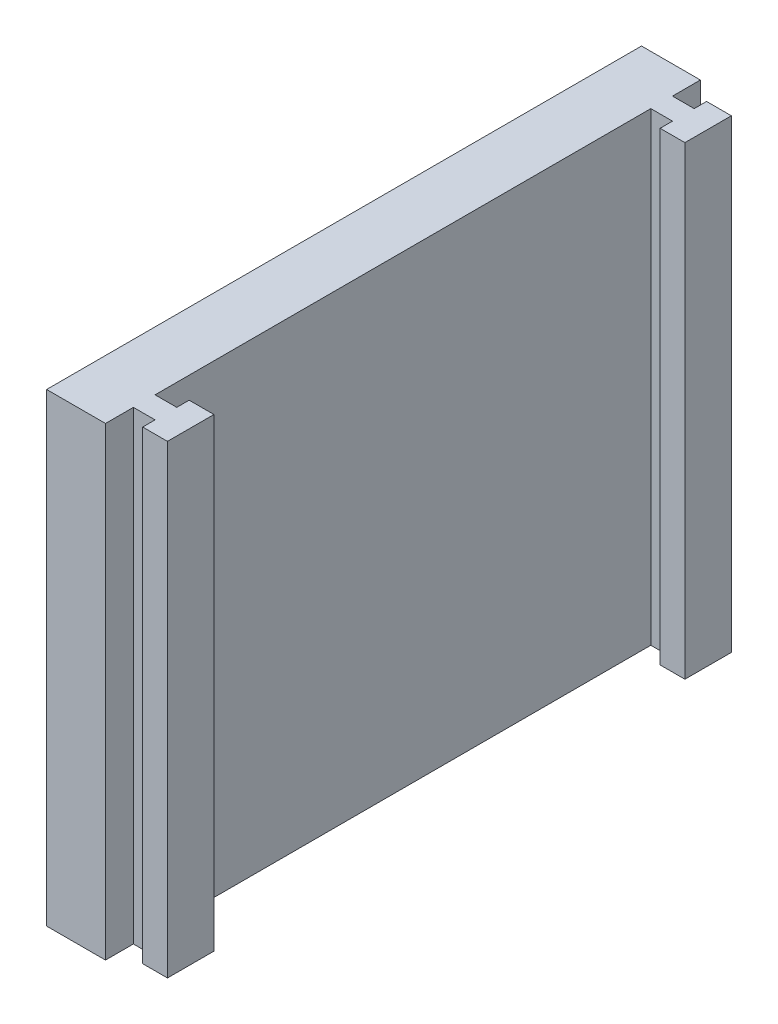
ISO-10303-21;
HEADER;
FILE_DESCRIPTION(('STEP AP214'),'2;1');
FILE_NAME('part.step','',(''),(''),'','','');
FILE_SCHEMA(('AUTOMOTIVE_DESIGN { 1 0 10303 214 1 1 1 1 }'));
ENDSEC;
DATA;
#1=APPLICATION_CONTEXT('core data for automotive mechanical design processes');
#2=APPLICATION_PROTOCOL_DEFINITION('international standard','automotive_design',2000,#1);
#3=PRODUCT_CONTEXT('',#1,'mechanical');
#4=PRODUCT('Part','Part','',(#3));
#5=PRODUCT_RELATED_PRODUCT_CATEGORY('part','',(#4));
#6=PRODUCT_DEFINITION_FORMATION('','',#4);
#7=PRODUCT_DEFINITION_CONTEXT('part definition',#1,'design');
#8=PRODUCT_DEFINITION('design','',#6,#7);
#9=PRODUCT_DEFINITION_SHAPE('','',#8);
#10=(LENGTH_UNIT() NAMED_UNIT(*) SI_UNIT(.MILLI.,.METRE.));
#11=(NAMED_UNIT(*) PLANE_ANGLE_UNIT() SI_UNIT($,.RADIAN.));
#12=(NAMED_UNIT(*) SI_UNIT($,.STERADIAN.) SOLID_ANGLE_UNIT());
#13=UNCERTAINTY_MEASURE_WITH_UNIT(LENGTH_MEASURE(1.E-05),#10,'distance_accuracy_value','');
#14=(GEOMETRIC_REPRESENTATION_CONTEXT(3) GLOBAL_UNCERTAINTY_ASSIGNED_CONTEXT((#13)) GLOBAL_UNIT_ASSIGNED_CONTEXT((#10,
#11,#12)) REPRESENTATION_CONTEXT('',''));
#15=CARTESIAN_POINT('',(0.,0.,0.));
#16=DIRECTION('',(0.,0.,1.));
#17=DIRECTION('',(1.,0.,0.));
#18=AXIS2_PLACEMENT_3D('',#15,#16,#17);
#19=CARTESIAN_POINT('',(19.,150.,-96.));
#20=DIRECTION('',(0.,0.,1.));
#21=DIRECTION('',(1.,0.,0.));
#22=AXIS2_PLACEMENT_3D('',#19,#20,#21);
#23=PLANE('',#22);
#24=DIRECTION('',(-1.,0.,0.));
#25=VECTOR('',#24,1.);
#26=CARTESIAN_POINT('',(19.,0.,-96.));
#27=LINE('',#26,#25);
#28=CARTESIAN_POINT('',(19.,0.,-96.));
#29=VERTEX_POINT('',#28);
#30=CARTESIAN_POINT('',(0.,0.,-96.));
#31=VERTEX_POINT('',#30);
#32=EDGE_CURVE('E158',#29,#31,#27,.T.);
#33=ORIENTED_EDGE('',*,*,#32,.T.);
#34=DIRECTION('',(0.,-1.,0.));
#35=VECTOR('',#34,1.);
#36=CARTESIAN_POINT('',(0.,150.,-96.));
#37=LINE('',#36,#35);
#38=CARTESIAN_POINT('',(0.,150.,-96.));
#39=VERTEX_POINT('',#38);
#40=EDGE_CURVE('E11',#39,#31,#37,.T.);
#41=ORIENTED_EDGE('',*,*,#40,.F.);
#42=DIRECTION('',(-1.,0.,0.));
#43=VECTOR('',#42,1.);
#44=CARTESIAN_POINT('',(19.,150.,-96.));
#45=LINE('',#44,#43);
#46=CARTESIAN_POINT('',(19.,150.,-96.));
#47=VERTEX_POINT('',#46);
#48=EDGE_CURVE('E181',#47,#39,#45,.T.);
#49=ORIENTED_EDGE('',*,*,#48,.F.);
#50=DIRECTION('',(0.,-1.,0.));
#51=VECTOR('',#50,1.);
#52=CARTESIAN_POINT('',(19.,150.,-96.));
#53=LINE('',#52,#51);
#54=EDGE_CURVE('E154',#47,#29,#53,.T.);
#55=ORIENTED_EDGE('',*,*,#54,.T.);
#56=EDGE_LOOP('',(#33,#41,#49,#55));
#57=FACE_BOUND('',#56,.T.);
#58=ADVANCED_FACE('F37',(#57),#23,.F.);
#59=CARTESIAN_POINT('',(0.,150.,0.));
#60=DIRECTION('',(1.,0.,0.));
#61=DIRECTION('',(0.,0.,-1.));
#62=AXIS2_PLACEMENT_3D('',#59,#60,#61);
#63=PLANE('',#62);
#64=DIRECTION('',(0.,0.,1.));
#65=VECTOR('',#64,1.);
#66=CARTESIAN_POINT('',(0.,0.,0.));
#67=LINE('',#66,#65);
#68=CARTESIAN_POINT('',(0.,0.,96.));
#69=VERTEX_POINT('',#68);
#70=EDGE_CURVE('E161',#31,#69,#67,.T.);
#71=ORIENTED_EDGE('',*,*,#70,.T.);
#72=DIRECTION('',(0.,-1.,0.));
#73=VECTOR('',#72,1.);
#74=CARTESIAN_POINT('',(0.,150.,96.));
#75=LINE('',#74,#73);
#76=CARTESIAN_POINT('',(0.,150.,96.));
#77=VERTEX_POINT('',#76);
#78=EDGE_CURVE('E259',#77,#69,#75,.T.);
#79=ORIENTED_EDGE('',*,*,#78,.F.);
#80=DIRECTION('',(0.,0.,1.));
#81=VECTOR('',#80,1.);
#82=CARTESIAN_POINT('',(0.,150.,0.));
#83=LINE('',#82,#81);
#84=EDGE_CURVE('E107',#39,#77,#83,.T.);
#85=ORIENTED_EDGE('',*,*,#84,.F.);
#86=ORIENTED_EDGE('',*,*,#40,.T.);
#87=EDGE_LOOP('',(#71,#79,#85,#86));
#88=FACE_BOUND('',#87,.T.);
#89=ADVANCED_FACE('F509',(#88),#63,.F.);
#90=CARTESIAN_POINT('',(19.,150.,-80.));
#91=DIRECTION('',(-1.,0.,0.));
#92=DIRECTION('',(0.,0.,1.));
#93=AXIS2_PLACEMENT_3D('',#90,#91,#92);
#94=PLANE('',#93);
#95=DIRECTION('',(0.,0.,-1.));
#96=VECTOR('',#95,1.);
#97=CARTESIAN_POINT('',(19.,0.,-80.));
#98=LINE('',#97,#96);
#99=CARTESIAN_POINT('',(19.,0.,80.));
#100=VERTEX_POINT('',#99);
#101=CARTESIAN_POINT('',(19.,0.,-80.));
#102=VERTEX_POINT('',#101);
#103=EDGE_CURVE('E165',#100,#102,#98,.T.);
#104=ORIENTED_EDGE('',*,*,#103,.T.);
#105=DIRECTION('',(0.,-1.,0.));
#106=VECTOR('',#105,1.);
#107=CARTESIAN_POINT('',(19.,150.,-80.));
#108=LINE('',#107,#106);
#109=CARTESIAN_POINT('',(19.,150.,-80.));
#110=VERTEX_POINT('',#109);
#111=EDGE_CURVE('E44',#110,#102,#108,.T.);
#112=ORIENTED_EDGE('',*,*,#111,.F.);
#113=DIRECTION('',(0.,0.,-1.));
#114=VECTOR('',#113,1.);
#115=CARTESIAN_POINT('',(19.,150.,-80.));
#116=LINE('',#115,#114);
#117=CARTESIAN_POINT('',(19.,150.,80.));
#118=VERTEX_POINT('',#117);
#119=EDGE_CURVE('E234',#118,#110,#116,.T.);
#120=ORIENTED_EDGE('',*,*,#119,.F.);
#121=DIRECTION('',(0.,-1.,0.));
#122=VECTOR('',#121,1.);
#123=CARTESIAN_POINT('',(19.,150.,80.));
#124=LINE('',#123,#122);
#125=EDGE_CURVE('E272',#118,#100,#124,.T.);
#126=ORIENTED_EDGE('',*,*,#125,.T.);
#127=EDGE_LOOP('',(#104,#112,#120,#126));
#128=FACE_BOUND('',#127,.T.);
#129=ADVANCED_FACE('F514',(#128),#94,.F.);
#130=CARTESIAN_POINT('',(26.,150.,-80.));
#131=DIRECTION('',(0.,0.,-1.));
#132=DIRECTION('',(-1.,0.,0.));
#133=AXIS2_PLACEMENT_3D('',#130,#131,#132);
#134=PLANE('',#133);
#135=DIRECTION('',(1.,0.,0.));
#136=VECTOR('',#135,1.);
#137=CARTESIAN_POINT('',(26.,0.,-80.));
#138=LINE('',#137,#136);
#139=CARTESIAN_POINT('',(26.,0.,-80.));
#140=VERTEX_POINT('',#139);
#141=EDGE_CURVE('E167',#102,#140,#138,.T.);
#142=ORIENTED_EDGE('',*,*,#141,.T.);
#143=DIRECTION('',(0.,-1.,0.));
#144=VECTOR('',#143,1.);
#145=CARTESIAN_POINT('',(26.,150.,-80.));
#146=LINE('',#145,#144);
#147=CARTESIAN_POINT('',(26.,150.,-80.));
#148=VERTEX_POINT('',#147);
#149=EDGE_CURVE('E194',#148,#140,#146,.T.);
#150=ORIENTED_EDGE('',*,*,#149,.F.);
#151=DIRECTION('',(1.,0.,0.));
#152=VECTOR('',#151,1.);
#153=CARTESIAN_POINT('',(26.,150.,-80.));
#154=LINE('',#153,#152);
#155=EDGE_CURVE('E203',#110,#148,#154,.T.);
#156=ORIENTED_EDGE('',*,*,#155,.F.);
#157=ORIENTED_EDGE('',*,*,#111,.T.);
#158=EDGE_LOOP('',(#142,#150,#156,#157));
#159=FACE_BOUND('',#158,.T.);
#160=ADVANCED_FACE('F201',(#159),#134,.F.);
#161=CARTESIAN_POINT('',(26.,150.,-76.));
#162=DIRECTION('',(1.,0.,0.));
#163=DIRECTION('',(0.,0.,-1.));
#164=AXIS2_PLACEMENT_3D('',#161,#162,#163);
#165=PLANE('',#164);
#166=DIRECTION('',(0.,0.,1.));
#167=VECTOR('',#166,1.);
#168=CARTESIAN_POINT('',(26.,0.,-76.));
#169=LINE('',#168,#167);
#170=CARTESIAN_POINT('',(26.,0.,-76.));
#171=VERTEX_POINT('',#170);
#172=EDGE_CURVE('E169',#140,#171,#169,.T.);
#173=ORIENTED_EDGE('',*,*,#172,.T.);
#174=DIRECTION('',(0.,-1.,0.));
#175=VECTOR('',#174,1.);
#176=CARTESIAN_POINT('',(26.,150.,-76.));
#177=LINE('',#176,#175);
#178=CARTESIAN_POINT('',(26.,150.,-76.));
#179=VERTEX_POINT('',#178);
#180=EDGE_CURVE('E191',#179,#171,#177,.T.);
#181=ORIENTED_EDGE('',*,*,#180,.F.);
#182=DIRECTION('',(0.,0.,1.));
#183=VECTOR('',#182,1.);
#184=CARTESIAN_POINT('',(26.,150.,-76.));
#185=LINE('',#184,#183);
#186=EDGE_CURVE('E228',#148,#179,#185,.T.);
#187=ORIENTED_EDGE('',*,*,#186,.F.);
#188=ORIENTED_EDGE('',*,*,#149,.T.);
#189=EDGE_LOOP('',(#173,#181,#187,#188));
#190=FACE_BOUND('',#189,.T.);
#191=ADVANCED_FACE('F219',(#190),#165,.F.);
#192=CARTESIAN_POINT('',(34.,150.,-76.));
#193=DIRECTION('',(0.,0.,-1.));
#194=DIRECTION('',(-1.,0.,0.));
#195=AXIS2_PLACEMENT_3D('',#192,#193,#194);
#196=PLANE('',#195);
#197=DIRECTION('',(1.,0.,0.));
#198=VECTOR('',#197,1.);
#199=CARTESIAN_POINT('',(34.,0.,-76.));
#200=LINE('',#199,#198);
#201=CARTESIAN_POINT('',(34.,0.,-76.));
#202=VERTEX_POINT('',#201);
#203=EDGE_CURVE('E171',#171,#202,#200,.T.);
#204=ORIENTED_EDGE('',*,*,#203,.T.);
#205=DIRECTION('',(0.,-1.,0.));
#206=VECTOR('',#205,1.);
#207=CARTESIAN_POINT('',(34.,150.,-76.));
#208=LINE('',#207,#206);
#209=CARTESIAN_POINT('',(34.,150.,-76.));
#210=VERTEX_POINT('',#209);
#211=EDGE_CURVE('E188',#210,#202,#208,.T.);
#212=ORIENTED_EDGE('',*,*,#211,.F.);
#213=DIRECTION('',(1.,0.,0.));
#214=VECTOR('',#213,1.);
#215=CARTESIAN_POINT('',(34.,150.,-76.));
#216=LINE('',#215,#214);
#217=EDGE_CURVE('E225',#179,#210,#216,.T.);
#218=ORIENTED_EDGE('',*,*,#217,.F.);
#219=ORIENTED_EDGE('',*,*,#180,.T.);
#220=EDGE_LOOP('',(#204,#212,#218,#219));
#221=FACE_BOUND('',#220,.T.);
#222=ADVANCED_FACE('F223',(#221),#196,.F.);
#223=CARTESIAN_POINT('',(34.,150.,-91.));
#224=DIRECTION('',(-1.,0.,0.));
#225=DIRECTION('',(0.,0.,1.));
#226=AXIS2_PLACEMENT_3D('',#223,#224,#225);
#227=PLANE('',#226);
#228=DIRECTION('',(0.,0.,-1.));
#229=VECTOR('',#228,1.);
#230=CARTESIAN_POINT('',(34.,0.,-91.));
#231=LINE('',#230,#229);
#232=CARTESIAN_POINT('',(34.,0.,-91.));
#233=VERTEX_POINT('',#232);
#234=EDGE_CURVE('E173',#202,#233,#231,.T.);
#235=ORIENTED_EDGE('',*,*,#234,.T.);
#236=DIRECTION('',(0.,-1.,0.));
#237=VECTOR('',#236,1.);
#238=CARTESIAN_POINT('',(34.,150.,-91.));
#239=LINE('',#238,#237);
#240=CARTESIAN_POINT('',(34.,150.,-91.));
#241=VERTEX_POINT('',#240);
#242=EDGE_CURVE('E185',#241,#233,#239,.T.);
#243=ORIENTED_EDGE('',*,*,#242,.F.);
#244=DIRECTION('',(0.,0.,-1.));
#245=VECTOR('',#244,1.);
#246=CARTESIAN_POINT('',(34.,150.,-91.));
#247=LINE('',#246,#245);
#248=EDGE_CURVE('E227',#210,#241,#247,.T.);
#249=ORIENTED_EDGE('',*,*,#248,.F.);
#250=ORIENTED_EDGE('',*,*,#211,.T.);
#251=EDGE_LOOP('',(#235,#243,#249,#250));
#252=FACE_BOUND('',#251,.T.);
#253=ADVANCED_FACE('F558',(#252),#227,.F.);
#254=CARTESIAN_POINT('',(26.,150.,-91.));
#255=DIRECTION('',(0.,0.,1.));
#256=DIRECTION('',(1.,0.,0.));
#257=AXIS2_PLACEMENT_3D('',#254,#255,#256);
#258=PLANE('',#257);
#259=DIRECTION('',(-1.,0.,0.));
#260=VECTOR('',#259,1.);
#261=CARTESIAN_POINT('',(26.,0.,-91.));
#262=LINE('',#261,#260);
#263=CARTESIAN_POINT('',(26.,0.,-91.));
#264=VERTEX_POINT('',#263);
#265=EDGE_CURVE('E175',#233,#264,#262,.T.);
#266=ORIENTED_EDGE('',*,*,#265,.T.);
#267=DIRECTION('',(0.,-1.,0.));
#268=VECTOR('',#267,1.);
#269=CARTESIAN_POINT('',(26.,150.,-91.));
#270=LINE('',#269,#268);
#271=CARTESIAN_POINT('',(26.,150.,-91.));
#272=VERTEX_POINT('',#271);
#273=EDGE_CURVE('E149',#272,#264,#270,.T.);
#274=ORIENTED_EDGE('',*,*,#273,.F.);
#275=DIRECTION('',(-1.,0.,0.));
#276=VECTOR('',#275,1.);
#277=CARTESIAN_POINT('',(26.,150.,-91.));
#278=LINE('',#277,#276);
#279=EDGE_CURVE('E137',#241,#272,#278,.T.);
#280=ORIENTED_EDGE('',*,*,#279,.F.);
#281=ORIENTED_EDGE('',*,*,#242,.T.);
#282=EDGE_LOOP('',(#266,#274,#280,#281));
#283=FACE_BOUND('',#282,.T.);
#284=ADVANCED_FACE('F561',(#283),#258,.F.);
#285=CARTESIAN_POINT('',(26.,150.,-87.));
#286=DIRECTION('',(1.,0.,0.));
#287=DIRECTION('',(0.,0.,-1.));
#288=AXIS2_PLACEMENT_3D('',#285,#286,#287);
#289=PLANE('',#288);
#290=DIRECTION('',(0.,0.,1.));
#291=VECTOR('',#290,1.);
#292=CARTESIAN_POINT('',(26.,0.,-87.));
#293=LINE('',#292,#291);
#294=CARTESIAN_POINT('',(26.,0.,-87.));
#295=VERTEX_POINT('',#294);
#296=EDGE_CURVE('E146',#264,#295,#293,.T.);
#297=ORIENTED_EDGE('',*,*,#296,.T.);
#298=DIRECTION('',(0.,-1.,0.));
#299=VECTOR('',#298,1.);
#300=CARTESIAN_POINT('',(26.,150.,-87.));
#301=LINE('',#300,#299);
#302=CARTESIAN_POINT('',(26.,150.,-87.));
#303=VERTEX_POINT('',#302);
#304=EDGE_CURVE('E143',#303,#295,#301,.T.);
#305=ORIENTED_EDGE('',*,*,#304,.F.);
#306=DIRECTION('',(0.,0.,1.));
#307=VECTOR('',#306,1.);
#308=CARTESIAN_POINT('',(26.,150.,-87.));
#309=LINE('',#308,#307);
#310=EDGE_CURVE('E130',#272,#303,#309,.T.);
#311=ORIENTED_EDGE('',*,*,#310,.F.);
#312=ORIENTED_EDGE('',*,*,#273,.T.);
#313=EDGE_LOOP('',(#297,#305,#311,#312));
#314=FACE_BOUND('',#313,.T.);
#315=ADVANCED_FACE('F144',(#314),#289,.F.);
#316=CARTESIAN_POINT('',(19.,150.,-87.));
#317=DIRECTION('',(0.,0.,1.));
#318=DIRECTION('',(1.,0.,0.));
#319=AXIS2_PLACEMENT_3D('',#316,#317,#318);
#320=PLANE('',#319);
#321=DIRECTION('',(-1.,0.,0.));
#322=VECTOR('',#321,1.);
#323=CARTESIAN_POINT('',(19.,0.,-87.));
#324=LINE('',#323,#322);
#325=CARTESIAN_POINT('',(19.,0.,-87.));
#326=VERTEX_POINT('',#325);
#327=EDGE_CURVE('E178',#295,#326,#324,.T.);
#328=ORIENTED_EDGE('',*,*,#327,.T.);
#329=DIRECTION('',(0.,-1.,0.));
#330=VECTOR('',#329,1.);
#331=CARTESIAN_POINT('',(19.,150.,-87.));
#332=LINE('',#331,#330);
#333=CARTESIAN_POINT('',(19.,150.,-87.));
#334=VERTEX_POINT('',#333);
#335=EDGE_CURVE('E150',#334,#326,#332,.T.);
#336=ORIENTED_EDGE('',*,*,#335,.F.);
#337=DIRECTION('',(-1.,0.,0.));
#338=VECTOR('',#337,1.);
#339=CARTESIAN_POINT('',(19.,150.,-87.));
#340=LINE('',#339,#338);
#341=EDGE_CURVE('E134',#303,#334,#340,.T.);
#342=ORIENTED_EDGE('',*,*,#341,.F.);
#343=ORIENTED_EDGE('',*,*,#304,.T.);
#344=EDGE_LOOP('',(#328,#336,#342,#343));
#345=FACE_BOUND('',#344,.T.);
#346=ADVANCED_FACE('F152',(#345),#320,.F.);
#347=CARTESIAN_POINT('',(19.,150.,-96.));
#348=DIRECTION('',(-1.,0.,0.));
#349=DIRECTION('',(0.,0.,1.));
#350=AXIS2_PLACEMENT_3D('',#347,#348,#349);
#351=PLANE('',#350);
#352=DIRECTION('',(0.,0.,-1.));
#353=VECTOR('',#352,1.);
#354=CARTESIAN_POINT('',(19.,0.,-96.));
#355=LINE('',#354,#353);
#356=EDGE_CURVE('E99',#326,#29,#355,.T.);
#357=ORIENTED_EDGE('',*,*,#356,.T.);
#358=ORIENTED_EDGE('',*,*,#54,.F.);
#359=DIRECTION('',(0.,0.,-1.));
#360=VECTOR('',#359,1.);
#361=CARTESIAN_POINT('',(19.,150.,-96.));
#362=LINE('',#361,#360);
#363=EDGE_CURVE('E60',#334,#47,#362,.T.);
#364=ORIENTED_EDGE('',*,*,#363,.F.);
#365=ORIENTED_EDGE('',*,*,#335,.T.);
#366=EDGE_LOOP('',(#357,#358,#364,#365));
#367=FACE_BOUND('',#366,.T.);
#368=ADVANCED_FACE('F570',(#367),#351,.F.);
#369=CARTESIAN_POINT('',(0.,150.,0.));
#370=DIRECTION('',(0.,-1.,0.));
#371=DIRECTION('',(0.,0.,-1.));
#372=AXIS2_PLACEMENT_3D('',#369,#370,#371);
#373=PLANE('',#372);
#374=ORIENTED_EDGE('',*,*,#48,.T.);
#375=ORIENTED_EDGE('',*,*,#84,.T.);
#376=DIRECTION('',(-1.,0.,0.));
#377=VECTOR('',#376,1.);
#378=CARTESIAN_POINT('',(19.,150.,96.));
#379=LINE('',#378,#377);
#380=CARTESIAN_POINT('',(19.,150.,96.));
#381=VERTEX_POINT('',#380);
#382=EDGE_CURVE('E303',#381,#77,#379,.T.);
#383=ORIENTED_EDGE('',*,*,#382,.F.);
#384=DIRECTION('',(0.,0.,1.));
#385=VECTOR('',#384,1.);
#386=CARTESIAN_POINT('',(19.,150.,96.));
#387=LINE('',#386,#385);
#388=CARTESIAN_POINT('',(19.,150.,87.));
#389=VERTEX_POINT('',#388);
#390=EDGE_CURVE('E299',#389,#381,#387,.T.);
#391=ORIENTED_EDGE('',*,*,#390,.F.);
#392=DIRECTION('',(-1.,0.,0.));
#393=VECTOR('',#392,1.);
#394=CARTESIAN_POINT('',(19.,150.,87.));
#395=LINE('',#394,#393);
#396=CARTESIAN_POINT('',(26.,150.,87.));
#397=VERTEX_POINT('',#396);
#398=EDGE_CURVE('E330',#397,#389,#395,.T.);
#399=ORIENTED_EDGE('',*,*,#398,.F.);
#400=DIRECTION('',(0.,0.,-1.));
#401=VECTOR('',#400,1.);
#402=CARTESIAN_POINT('',(26.,150.,87.));
#403=LINE('',#402,#401);
#404=CARTESIAN_POINT('',(26.,150.,91.));
#405=VERTEX_POINT('',#404);
#406=EDGE_CURVE('E333',#405,#397,#403,.T.);
#407=ORIENTED_EDGE('',*,*,#406,.F.);
#408=DIRECTION('',(-1.,0.,0.));
#409=VECTOR('',#408,1.);
#410=CARTESIAN_POINT('',(26.,150.,91.));
#411=LINE('',#410,#409);
#412=CARTESIAN_POINT('',(34.,150.,91.));
#413=VERTEX_POINT('',#412);
#414=EDGE_CURVE('E336',#413,#405,#411,.T.);
#415=ORIENTED_EDGE('',*,*,#414,.F.);
#416=DIRECTION('',(0.,0.,1.));
#417=VECTOR('',#416,1.);
#418=CARTESIAN_POINT('',(34.,150.,91.));
#419=LINE('',#418,#417);
#420=CARTESIAN_POINT('',(34.,150.,76.));
#421=VERTEX_POINT('',#420);
#422=EDGE_CURVE('E339',#421,#413,#419,.T.);
#423=ORIENTED_EDGE('',*,*,#422,.F.);
#424=DIRECTION('',(1.,0.,0.));
#425=VECTOR('',#424,1.);
#426=CARTESIAN_POINT('',(34.,150.,76.));
#427=LINE('',#426,#425);
#428=CARTESIAN_POINT('',(26.,150.,76.));
#429=VERTEX_POINT('',#428);
#430=EDGE_CURVE('E342',#429,#421,#427,.T.);
#431=ORIENTED_EDGE('',*,*,#430,.F.);
#432=DIRECTION('',(0.,0.,-1.));
#433=VECTOR('',#432,1.);
#434=CARTESIAN_POINT('',(26.,150.,76.));
#435=LINE('',#434,#433);
#436=CARTESIAN_POINT('',(26.,150.,80.));
#437=VERTEX_POINT('',#436);
#438=EDGE_CURVE('E345',#437,#429,#435,.T.);
#439=ORIENTED_EDGE('',*,*,#438,.F.);
#440=DIRECTION('',(1.,0.,0.));
#441=VECTOR('',#440,1.);
#442=CARTESIAN_POINT('',(26.,150.,80.));
#443=LINE('',#442,#441);
#444=EDGE_CURVE('E348',#118,#437,#443,.T.);
#445=ORIENTED_EDGE('',*,*,#444,.F.);
#446=ORIENTED_EDGE('',*,*,#119,.T.);
#447=ORIENTED_EDGE('',*,*,#155,.T.);
#448=ORIENTED_EDGE('',*,*,#186,.T.);
#449=ORIENTED_EDGE('',*,*,#217,.T.);
#450=ORIENTED_EDGE('',*,*,#248,.T.);
#451=ORIENTED_EDGE('',*,*,#279,.T.);
#452=ORIENTED_EDGE('',*,*,#310,.T.);
#453=ORIENTED_EDGE('',*,*,#341,.T.);
#454=ORIENTED_EDGE('',*,*,#363,.T.);
#455=EDGE_LOOP('',(#374,#375,#383,#391,#399,#407,#415,#423,#431,#439,#445,#446,#447,#448,#449,
#450,#451,#452,#453,#454));
#456=FACE_BOUND('',#455,.T.);
#457=ADVANCED_FACE('F132',(#456),#373,.F.);
#458=CARTESIAN_POINT('',(0.,0.,0.));
#459=DIRECTION('',(0.,-1.,0.));
#460=DIRECTION('',(0.,0.,-1.));
#461=AXIS2_PLACEMENT_3D('',#458,#459,#460);
#462=PLANE('',#461);
#463=CARTESIAN_POINT('',(6.,0.,-82.5));
#464=DIRECTION('',(0.,-1.,0.));
#465=DIRECTION('',(0.,0.,1.));
#466=AXIS2_PLACEMENT_3D('',#463,#464,#465);
#467=CIRCLE('',#466,8.99999999999999);
#468=CARTESIAN_POINT('',(8.95803989154979,0.,-91.));
#469=VERTEX_POINT('',#468);
#470=CARTESIAN_POINT('',(8.95803989154979,0.,-74.));
#471=VERTEX_POINT('',#470);
#472=EDGE_CURVE('E51',#469,#471,#467,.T.);
#473=ORIENTED_EDGE('',*,*,#472,.F.);
#474=DIRECTION('',(1.,0.,0.));
#475=VECTOR('',#474,1.);
#476=CARTESIAN_POINT('',(8.95803989154979,0.,-91.));
#477=LINE('',#476,#475);
#478=CARTESIAN_POINT('',(5.,0.,-91.));
#479=VERTEX_POINT('',#478);
#480=EDGE_CURVE('E248',#479,#469,#477,.T.);
#481=ORIENTED_EDGE('',*,*,#480,.F.);
#482=DIRECTION('',(0.,0.,-1.));
#483=VECTOR('',#482,1.);
#484=CARTESIAN_POINT('',(5.,0.,-91.));
#485=LINE('',#484,#483);
#486=CARTESIAN_POINT('',(5.,0.,-74.));
#487=VERTEX_POINT('',#486);
#488=EDGE_CURVE('E252',#487,#479,#485,.T.);
#489=ORIENTED_EDGE('',*,*,#488,.F.);
#490=DIRECTION('',(-1.,0.,0.));
#491=VECTOR('',#490,1.);
#492=CARTESIAN_POINT('',(8.95803989154979,0.,-74.));
#493=LINE('',#492,#491);
#494=EDGE_CURVE('E255',#471,#487,#493,.T.);
#495=ORIENTED_EDGE('',*,*,#494,.F.);
#496=EDGE_LOOP('',(#473,#481,#489,#495));
#497=FACE_BOUND('',#496,.T.);
#498=ORIENTED_EDGE('',*,*,#32,.F.);
#499=ORIENTED_EDGE('',*,*,#356,.F.);
#500=ORIENTED_EDGE('',*,*,#327,.F.);
#501=ORIENTED_EDGE('',*,*,#296,.F.);
#502=ORIENTED_EDGE('',*,*,#265,.F.);
#503=ORIENTED_EDGE('',*,*,#234,.F.);
#504=ORIENTED_EDGE('',*,*,#203,.F.);
#505=ORIENTED_EDGE('',*,*,#172,.F.);
#506=ORIENTED_EDGE('',*,*,#141,.F.);
#507=ORIENTED_EDGE('',*,*,#103,.F.);
#508=DIRECTION('',(1.,0.,0.));
#509=VECTOR('',#508,1.);
#510=CARTESIAN_POINT('',(26.,0.,80.));
#511=LINE('',#510,#509);
#512=CARTESIAN_POINT('',(26.,0.,80.));
#513=VERTEX_POINT('',#512);
#514=EDGE_CURVE('E322',#100,#513,#511,.T.);
#515=ORIENTED_EDGE('',*,*,#514,.T.);
#516=DIRECTION('',(0.,0.,-1.));
#517=VECTOR('',#516,1.);
#518=CARTESIAN_POINT('',(26.,0.,76.));
#519=LINE('',#518,#517);
#520=CARTESIAN_POINT('',(26.,0.,76.));
#521=VERTEX_POINT('',#520);
#522=EDGE_CURVE('E319',#513,#521,#519,.T.);
#523=ORIENTED_EDGE('',*,*,#522,.T.);
#524=DIRECTION('',(1.,0.,0.));
#525=VECTOR('',#524,1.);
#526=CARTESIAN_POINT('',(34.,0.,76.));
#527=LINE('',#526,#525);
#528=CARTESIAN_POINT('',(34.,0.,76.));
#529=VERTEX_POINT('',#528);
#530=EDGE_CURVE('E316',#521,#529,#527,.T.);
#531=ORIENTED_EDGE('',*,*,#530,.T.);
#532=DIRECTION('',(0.,0.,1.));
#533=VECTOR('',#532,1.);
#534=CARTESIAN_POINT('',(34.,0.,91.));
#535=LINE('',#534,#533);
#536=CARTESIAN_POINT('',(34.,0.,91.));
#537=VERTEX_POINT('',#536);
#538=EDGE_CURVE('E313',#529,#537,#535,.T.);
#539=ORIENTED_EDGE('',*,*,#538,.T.);
#540=DIRECTION('',(-1.,0.,0.));
#541=VECTOR('',#540,1.);
#542=CARTESIAN_POINT('',(26.,0.,91.));
#543=LINE('',#542,#541);
#544=CARTESIAN_POINT('',(26.,0.,91.));
#545=VERTEX_POINT('',#544);
#546=EDGE_CURVE('E310',#537,#545,#543,.T.);
#547=ORIENTED_EDGE('',*,*,#546,.T.);
#548=DIRECTION('',(0.,0.,-1.));
#549=VECTOR('',#548,1.);
#550=CARTESIAN_POINT('',(26.,0.,87.));
#551=LINE('',#550,#549);
#552=CARTESIAN_POINT('',(26.,0.,87.));
#553=VERTEX_POINT('',#552);
#554=EDGE_CURVE('E307',#545,#553,#551,.T.);
#555=ORIENTED_EDGE('',*,*,#554,.T.);
#556=DIRECTION('',(-1.,0.,0.));
#557=VECTOR('',#556,1.);
#558=CARTESIAN_POINT('',(19.,0.,87.));
#559=LINE('',#558,#557);
#560=CARTESIAN_POINT('',(19.,0.,87.));
#561=VERTEX_POINT('',#560);
#562=EDGE_CURVE('E304',#553,#561,#559,.T.);
#563=ORIENTED_EDGE('',*,*,#562,.T.);
#564=DIRECTION('',(0.,0.,1.));
#565=VECTOR('',#564,1.);
#566=CARTESIAN_POINT('',(19.,0.,96.));
#567=LINE('',#566,#565);
#568=CARTESIAN_POINT('',(19.,0.,96.));
#569=VERTEX_POINT('',#568);
#570=EDGE_CURVE('E300',#561,#569,#567,.T.);
#571=ORIENTED_EDGE('',*,*,#570,.T.);
#572=DIRECTION('',(-1.,0.,0.));
#573=VECTOR('',#572,1.);
#574=CARTESIAN_POINT('',(19.,0.,96.));
#575=LINE('',#574,#573);
#576=EDGE_CURVE('E324',#569,#69,#575,.T.);
#577=ORIENTED_EDGE('',*,*,#576,.T.);
#578=ORIENTED_EDGE('',*,*,#70,.F.);
#579=EDGE_LOOP('',(#498,#499,#500,#501,#502,#503,#504,#505,#506,#507,#515,#523,#531,#539,#547,
#555,#563,#571,#577,#578));
#580=FACE_BOUND('',#579,.T.);
#581=CARTESIAN_POINT('',(6.00000000000002,0.,82.5));
#582=DIRECTION('',(0.,1.,0.));
#583=DIRECTION('',(0.,0.,-1.));
#584=AXIS2_PLACEMENT_3D('',#581,#582,#583);
#585=CIRCLE('',#584,8.99999999999999);
#586=CARTESIAN_POINT('',(8.95803989154981,0.,91.));
#587=VERTEX_POINT('',#586);
#588=CARTESIAN_POINT('',(8.9580398915498,0.,74.));
#589=VERTEX_POINT('',#588);
#590=EDGE_CURVE('E375',#587,#589,#585,.T.);
#591=ORIENTED_EDGE('',*,*,#590,.T.);
#592=DIRECTION('',(-1.,0.,0.));
#593=VECTOR('',#592,1.);
#594=CARTESIAN_POINT('',(8.9580398915498,0.,74.));
#595=LINE('',#594,#593);
#596=CARTESIAN_POINT('',(5.00000000000002,0.,74.));
#597=VERTEX_POINT('',#596);
#598=EDGE_CURVE('E372',#589,#597,#595,.T.);
#599=ORIENTED_EDGE('',*,*,#598,.T.);
#600=DIRECTION('',(0.,0.,1.));
#601=VECTOR('',#600,1.);
#602=CARTESIAN_POINT('',(5.00000000000002,0.,91.));
#603=LINE('',#602,#601);
#604=CARTESIAN_POINT('',(5.00000000000002,0.,91.));
#605=VERTEX_POINT('',#604);
#606=EDGE_CURVE('E369',#597,#605,#603,.T.);
#607=ORIENTED_EDGE('',*,*,#606,.T.);
#608=DIRECTION('',(1.,0.,0.));
#609=VECTOR('',#608,1.);
#610=CARTESIAN_POINT('',(8.95803989154981,0.,91.));
#611=LINE('',#610,#609);
#612=EDGE_CURVE('E365',#605,#587,#611,.T.);
#613=ORIENTED_EDGE('',*,*,#612,.T.);
#614=EDGE_LOOP('',(#591,#599,#607,#613));
#615=FACE_BOUND('',#614,.T.);
#616=ADVANCED_FACE('F210',(#497,#580,#615),#462,.T.);
#617=CARTESIAN_POINT('',(6.,145.,-82.5));
#618=DIRECTION('',(0.,-1.,0.));
#619=DIRECTION('',(0.,0.,-1.));
#620=AXIS2_PLACEMENT_3D('',#617,#618,#619);
#621=CYLINDRICAL_SURFACE('',#620,8.99999999999999);
#622=ORIENTED_EDGE('',*,*,#472,.T.);
#623=DIRECTION('',(0.,-1.,0.));
#624=VECTOR('',#623,1.);
#625=CARTESIAN_POINT('',(8.95803989154979,145.,-74.));
#626=LINE('',#625,#624);
#627=CARTESIAN_POINT('',(8.95803989154979,145.,-74.));
#628=VERTEX_POINT('',#627);
#629=EDGE_CURVE('E238',#628,#471,#626,.T.);
#630=ORIENTED_EDGE('',*,*,#629,.F.);
#631=CARTESIAN_POINT('',(6.,145.,-82.5));
#632=DIRECTION('',(0.,-1.,0.));
#633=DIRECTION('',(0.,0.,1.));
#634=AXIS2_PLACEMENT_3D('',#631,#632,#633);
#635=CIRCLE('',#634,8.99999999999999);
#636=CARTESIAN_POINT('',(8.95803989154979,145.,-91.));
#637=VERTEX_POINT('',#636);
#638=EDGE_CURVE('E251',#637,#628,#635,.T.);
#639=ORIENTED_EDGE('',*,*,#638,.F.);
#640=DIRECTION('',(0.,-1.,0.));
#641=VECTOR('',#640,1.);
#642=CARTESIAN_POINT('',(8.95803989154979,145.,-91.));
#643=LINE('',#642,#641);
#644=EDGE_CURVE('E162',#637,#469,#643,.T.);
#645=ORIENTED_EDGE('',*,*,#644,.T.);
#646=EDGE_LOOP('',(#622,#630,#639,#645));
#647=FACE_BOUND('',#646,.T.);
#648=ADVANCED_FACE('F486',(#647),#621,.F.);
#649=CARTESIAN_POINT('',(8.95803989154979,145.,-91.));
#650=DIRECTION('',(0.,0.,-1.));
#651=DIRECTION('',(-1.,0.,0.));
#652=AXIS2_PLACEMENT_3D('',#649,#650,#651);
#653=PLANE('',#652);
#654=ORIENTED_EDGE('',*,*,#480,.T.);
#655=ORIENTED_EDGE('',*,*,#644,.F.);
#656=DIRECTION('',(1.,0.,0.));
#657=VECTOR('',#656,1.);
#658=CARTESIAN_POINT('',(8.95803989154979,145.,-91.));
#659=LINE('',#658,#657);
#660=CARTESIAN_POINT('',(5.,145.,-91.));
#661=VERTEX_POINT('',#660);
#662=EDGE_CURVE('E241',#661,#637,#659,.T.);
#663=ORIENTED_EDGE('',*,*,#662,.F.);
#664=DIRECTION('',(0.,-1.,0.));
#665=VECTOR('',#664,1.);
#666=CARTESIAN_POINT('',(5.,145.,-91.));
#667=LINE('',#666,#665);
#668=EDGE_CURVE('E244',#661,#479,#667,.T.);
#669=ORIENTED_EDGE('',*,*,#668,.T.);
#670=EDGE_LOOP('',(#654,#655,#663,#669));
#671=FACE_BOUND('',#670,.T.);
#672=ADVANCED_FACE('F488',(#671),#653,.F.);
#673=CARTESIAN_POINT('',(5.,145.,-91.));
#674=DIRECTION('',(-1.,0.,0.));
#675=DIRECTION('',(0.,0.,1.));
#676=AXIS2_PLACEMENT_3D('',#673,#674,#675);
#677=PLANE('',#676);
#678=ORIENTED_EDGE('',*,*,#488,.T.);
#679=ORIENTED_EDGE('',*,*,#668,.F.);
#680=DIRECTION('',(0.,0.,-1.));
#681=VECTOR('',#680,1.);
#682=CARTESIAN_POINT('',(5.,145.,-91.));
#683=LINE('',#682,#681);
#684=CARTESIAN_POINT('',(5.,145.,-74.));
#685=VERTEX_POINT('',#684);
#686=EDGE_CURVE('E262',#685,#661,#683,.T.);
#687=ORIENTED_EDGE('',*,*,#686,.F.);
#688=DIRECTION('',(0.,-1.,0.));
#689=VECTOR('',#688,1.);
#690=CARTESIAN_POINT('',(5.,145.,-74.));
#691=LINE('',#690,#689);
#692=EDGE_CURVE('E240',#685,#487,#691,.T.);
#693=ORIENTED_EDGE('',*,*,#692,.T.);
#694=EDGE_LOOP('',(#678,#679,#687,#693));
#695=FACE_BOUND('',#694,.T.);
#696=ADVANCED_FACE('F499',(#695),#677,.F.);
#697=CARTESIAN_POINT('',(8.95803989154979,145.,-74.));
#698=DIRECTION('',(0.,0.,1.));
#699=DIRECTION('',(1.,0.,0.));
#700=AXIS2_PLACEMENT_3D('',#697,#698,#699);
#701=PLANE('',#700);
#702=ORIENTED_EDGE('',*,*,#494,.T.);
#703=ORIENTED_EDGE('',*,*,#692,.F.);
#704=DIRECTION('',(-1.,0.,0.));
#705=VECTOR('',#704,1.);
#706=CARTESIAN_POINT('',(8.95803989154979,145.,-74.));
#707=LINE('',#706,#705);
#708=EDGE_CURVE('E265',#628,#685,#707,.T.);
#709=ORIENTED_EDGE('',*,*,#708,.F.);
#710=ORIENTED_EDGE('',*,*,#629,.T.);
#711=EDGE_LOOP('',(#702,#703,#709,#710));
#712=FACE_BOUND('',#711,.T.);
#713=ADVANCED_FACE('F493',(#712),#701,.F.);
#714=CARTESIAN_POINT('',(6.,145.,-82.5));
#715=DIRECTION('',(0.,1.,0.));
#716=DIRECTION('',(0.,0.,1.));
#717=AXIS2_PLACEMENT_3D('',#714,#715,#716);
#718=PLANE('',#717);
#719=ORIENTED_EDGE('',*,*,#638,.T.);
#720=ORIENTED_EDGE('',*,*,#708,.T.);
#721=ORIENTED_EDGE('',*,*,#686,.T.);
#722=ORIENTED_EDGE('',*,*,#662,.T.);
#723=EDGE_LOOP('',(#719,#720,#721,#722));
#724=FACE_BOUND('',#723,.T.);
#725=ADVANCED_FACE('F497',(#724),#718,.F.);
#726=CARTESIAN_POINT('',(19.,150.,96.));
#727=DIRECTION('',(0.,0.,-1.));
#728=DIRECTION('',(1.,0.,0.));
#729=AXIS2_PLACEMENT_3D('',#726,#727,#728);
#730=PLANE('',#729);
#731=ORIENTED_EDGE('',*,*,#576,.F.);
#732=DIRECTION('',(0.,-1.,0.));
#733=VECTOR('',#732,1.);
#734=CARTESIAN_POINT('',(19.,150.,96.));
#735=LINE('',#734,#733);
#736=EDGE_CURVE('E296',#381,#569,#735,.T.);
#737=ORIENTED_EDGE('',*,*,#736,.F.);
#738=ORIENTED_EDGE('',*,*,#382,.T.);
#739=ORIENTED_EDGE('',*,*,#78,.T.);
#740=EDGE_LOOP('',(#731,#737,#738,#739));
#741=FACE_BOUND('',#740,.T.);
#742=ADVANCED_FACE('F519',(#741),#730,.F.);
#743=CARTESIAN_POINT('',(26.,150.,80.));
#744=DIRECTION('',(0.,0.,1.));
#745=DIRECTION('',(-1.,0.,0.));
#746=AXIS2_PLACEMENT_3D('',#743,#744,#745);
#747=PLANE('',#746);
#748=ORIENTED_EDGE('',*,*,#514,.F.);
#749=ORIENTED_EDGE('',*,*,#125,.F.);
#750=ORIENTED_EDGE('',*,*,#444,.T.);
#751=DIRECTION('',(0.,-1.,0.));
#752=VECTOR('',#751,1.);
#753=CARTESIAN_POINT('',(26.,150.,80.));
#754=LINE('',#753,#752);
#755=EDGE_CURVE('E275',#437,#513,#754,.T.);
#756=ORIENTED_EDGE('',*,*,#755,.T.);
#757=EDGE_LOOP('',(#748,#749,#750,#756));
#758=FACE_BOUND('',#757,.T.);
#759=ADVANCED_FACE('F546',(#758),#747,.F.);
#760=CARTESIAN_POINT('',(26.,150.,76.));
#761=DIRECTION('',(1.,0.,0.));
#762=DIRECTION('',(0.,0.,1.));
#763=AXIS2_PLACEMENT_3D('',#760,#761,#762);
#764=PLANE('',#763);
#765=ORIENTED_EDGE('',*,*,#522,.F.);
#766=ORIENTED_EDGE('',*,*,#755,.F.);
#767=ORIENTED_EDGE('',*,*,#438,.T.);
#768=DIRECTION('',(0.,-1.,0.));
#769=VECTOR('',#768,1.);
#770=CARTESIAN_POINT('',(26.,150.,76.));
#771=LINE('',#770,#769);
#772=EDGE_CURVE('E278',#429,#521,#771,.T.);
#773=ORIENTED_EDGE('',*,*,#772,.T.);
#774=EDGE_LOOP('',(#765,#766,#767,#773));
#775=FACE_BOUND('',#774,.T.);
#776=ADVANCED_FACE('F544',(#775),#764,.F.);
#777=CARTESIAN_POINT('',(34.,150.,76.));
#778=DIRECTION('',(0.,0.,1.));
#779=DIRECTION('',(-1.,0.,0.));
#780=AXIS2_PLACEMENT_3D('',#777,#778,#779);
#781=PLANE('',#780);
#782=ORIENTED_EDGE('',*,*,#530,.F.);
#783=ORIENTED_EDGE('',*,*,#772,.F.);
#784=ORIENTED_EDGE('',*,*,#430,.T.);
#785=DIRECTION('',(0.,-1.,0.));
#786=VECTOR('',#785,1.);
#787=CARTESIAN_POINT('',(34.,150.,76.));
#788=LINE('',#787,#786);
#789=EDGE_CURVE('E281',#421,#529,#788,.T.);
#790=ORIENTED_EDGE('',*,*,#789,.T.);
#791=EDGE_LOOP('',(#782,#783,#784,#790));
#792=FACE_BOUND('',#791,.T.);
#793=ADVANCED_FACE('F539',(#792),#781,.F.);
#794=CARTESIAN_POINT('',(34.,150.,91.));
#795=DIRECTION('',(-1.,0.,0.));
#796=DIRECTION('',(0.,0.,-1.));
#797=AXIS2_PLACEMENT_3D('',#794,#795,#796);
#798=PLANE('',#797);
#799=ORIENTED_EDGE('',*,*,#538,.F.);
#800=ORIENTED_EDGE('',*,*,#789,.F.);
#801=ORIENTED_EDGE('',*,*,#422,.T.);
#802=DIRECTION('',(0.,-1.,0.));
#803=VECTOR('',#802,1.);
#804=CARTESIAN_POINT('',(34.,150.,91.));
#805=LINE('',#804,#803);
#806=EDGE_CURVE('E284',#413,#537,#805,.T.);
#807=ORIENTED_EDGE('',*,*,#806,.T.);
#808=EDGE_LOOP('',(#799,#800,#801,#807));
#809=FACE_BOUND('',#808,.T.);
#810=ADVANCED_FACE('F536',(#809),#798,.F.);
#811=CARTESIAN_POINT('',(26.,150.,91.));
#812=DIRECTION('',(0.,0.,-1.));
#813=DIRECTION('',(1.,0.,0.));
#814=AXIS2_PLACEMENT_3D('',#811,#812,#813);
#815=PLANE('',#814);
#816=ORIENTED_EDGE('',*,*,#546,.F.);
#817=ORIENTED_EDGE('',*,*,#806,.F.);
#818=ORIENTED_EDGE('',*,*,#414,.T.);
#819=DIRECTION('',(0.,-1.,0.));
#820=VECTOR('',#819,1.);
#821=CARTESIAN_POINT('',(26.,150.,91.));
#822=LINE('',#821,#820);
#823=EDGE_CURVE('E287',#405,#545,#822,.T.);
#824=ORIENTED_EDGE('',*,*,#823,.T.);
#825=EDGE_LOOP('',(#816,#817,#818,#824));
#826=FACE_BOUND('',#825,.T.);
#827=ADVANCED_FACE('F534',(#826),#815,.F.);
#828=CARTESIAN_POINT('',(26.,150.,87.));
#829=DIRECTION('',(1.,0.,0.));
#830=DIRECTION('',(0.,0.,1.));
#831=AXIS2_PLACEMENT_3D('',#828,#829,#830);
#832=PLANE('',#831);
#833=ORIENTED_EDGE('',*,*,#554,.F.);
#834=ORIENTED_EDGE('',*,*,#823,.F.);
#835=ORIENTED_EDGE('',*,*,#406,.T.);
#836=DIRECTION('',(0.,-1.,0.));
#837=VECTOR('',#836,1.);
#838=CARTESIAN_POINT('',(26.,150.,87.));
#839=LINE('',#838,#837);
#840=EDGE_CURVE('E290',#397,#553,#839,.T.);
#841=ORIENTED_EDGE('',*,*,#840,.T.);
#842=EDGE_LOOP('',(#833,#834,#835,#841));
#843=FACE_BOUND('',#842,.T.);
#844=ADVANCED_FACE('F530',(#843),#832,.F.);
#845=CARTESIAN_POINT('',(19.,150.,87.));
#846=DIRECTION('',(0.,0.,-1.));
#847=DIRECTION('',(1.,0.,0.));
#848=AXIS2_PLACEMENT_3D('',#845,#846,#847);
#849=PLANE('',#848);
#850=ORIENTED_EDGE('',*,*,#562,.F.);
#851=ORIENTED_EDGE('',*,*,#840,.F.);
#852=ORIENTED_EDGE('',*,*,#398,.T.);
#853=DIRECTION('',(0.,-1.,0.));
#854=VECTOR('',#853,1.);
#855=CARTESIAN_POINT('',(19.,150.,87.));
#856=LINE('',#855,#854);
#857=EDGE_CURVE('E293',#389,#561,#856,.T.);
#858=ORIENTED_EDGE('',*,*,#857,.T.);
#859=EDGE_LOOP('',(#850,#851,#852,#858));
#860=FACE_BOUND('',#859,.T.);
#861=ADVANCED_FACE('F527',(#860),#849,.F.);
#862=CARTESIAN_POINT('',(19.,150.,96.));
#863=DIRECTION('',(-1.,0.,0.));
#864=DIRECTION('',(0.,0.,-1.));
#865=AXIS2_PLACEMENT_3D('',#862,#863,#864);
#866=PLANE('',#865);
#867=ORIENTED_EDGE('',*,*,#570,.F.);
#868=ORIENTED_EDGE('',*,*,#857,.F.);
#869=ORIENTED_EDGE('',*,*,#390,.T.);
#870=ORIENTED_EDGE('',*,*,#736,.T.);
#871=EDGE_LOOP('',(#867,#868,#869,#870));
#872=FACE_BOUND('',#871,.T.);
#873=ADVANCED_FACE('F525',(#872),#866,.F.);
#874=CARTESIAN_POINT('',(6.00000000000002,145.,82.5));
#875=DIRECTION('',(0.,-1.,0.));
#876=DIRECTION('',(0.,0.,1.));
#877=AXIS2_PLACEMENT_3D('',#874,#875,#876);
#878=CYLINDRICAL_SURFACE('',#877,8.99999999999999);
#879=ORIENTED_EDGE('',*,*,#590,.F.);
#880=DIRECTION('',(0.,-1.,0.));
#881=VECTOR('',#880,1.);
#882=CARTESIAN_POINT('',(8.95803989154981,145.,91.));
#883=LINE('',#882,#881);
#884=CARTESIAN_POINT('',(8.95803989154981,145.,91.));
#885=VERTEX_POINT('',#884);
#886=EDGE_CURVE('E327',#885,#587,#883,.T.);
#887=ORIENTED_EDGE('',*,*,#886,.F.);
#888=CARTESIAN_POINT('',(6.00000000000002,145.,82.5));
#889=DIRECTION('',(0.,1.,0.));
#890=DIRECTION('',(0.,0.,-1.));
#891=AXIS2_PLACEMENT_3D('',#888,#889,#890);
#892=CIRCLE('',#891,8.99999999999999);
#893=CARTESIAN_POINT('',(8.9580398915498,145.,74.));
#894=VERTEX_POINT('',#893);
#895=EDGE_CURVE('E368',#885,#894,#892,.T.);
#896=ORIENTED_EDGE('',*,*,#895,.T.);
#897=DIRECTION('',(0.,-1.,0.));
#898=VECTOR('',#897,1.);
#899=CARTESIAN_POINT('',(8.9580398915498,145.,74.));
#900=LINE('',#899,#898);
#901=EDGE_CURVE('E353',#894,#589,#900,.T.);
#902=ORIENTED_EDGE('',*,*,#901,.T.);
#903=EDGE_LOOP('',(#879,#887,#896,#902));
#904=FACE_BOUND('',#903,.T.);
#905=ADVANCED_FACE('F392',(#904),#878,.F.);
#906=CARTESIAN_POINT('',(8.95803989154981,145.,91.));
#907=DIRECTION('',(0.,0.,1.));
#908=DIRECTION('',(-1.,0.,0.));
#909=AXIS2_PLACEMENT_3D('',#906,#907,#908);
#910=PLANE('',#909);
#911=ORIENTED_EDGE('',*,*,#612,.F.);
#912=DIRECTION('',(0.,-1.,0.));
#913=VECTOR('',#912,1.);
#914=CARTESIAN_POINT('',(5.00000000000002,145.,91.));
#915=LINE('',#914,#913);
#916=CARTESIAN_POINT('',(5.00000000000002,145.,91.));
#917=VERTEX_POINT('',#916);
#918=EDGE_CURVE('E360',#917,#605,#915,.T.);
#919=ORIENTED_EDGE('',*,*,#918,.F.);
#920=DIRECTION('',(1.,0.,0.));
#921=VECTOR('',#920,1.);
#922=CARTESIAN_POINT('',(8.95803989154981,145.,91.));
#923=LINE('',#922,#921);
#924=EDGE_CURVE('E357',#917,#885,#923,.T.);
#925=ORIENTED_EDGE('',*,*,#924,.T.);
#926=ORIENTED_EDGE('',*,*,#886,.T.);
#927=EDGE_LOOP('',(#911,#919,#925,#926));
#928=FACE_BOUND('',#927,.T.);
#929=ADVANCED_FACE('F597',(#928),#910,.F.);
#930=CARTESIAN_POINT('',(5.00000000000002,145.,91.));
#931=DIRECTION('',(-1.,0.,0.));
#932=DIRECTION('',(0.,0.,-1.));
#933=AXIS2_PLACEMENT_3D('',#930,#931,#932);
#934=PLANE('',#933);
#935=ORIENTED_EDGE('',*,*,#606,.F.);
#936=DIRECTION('',(0.,-1.,0.));
#937=VECTOR('',#936,1.);
#938=CARTESIAN_POINT('',(5.00000000000002,145.,74.));
#939=LINE('',#938,#937);
#940=CARTESIAN_POINT('',(5.00000000000002,145.,74.));
#941=VERTEX_POINT('',#940);
#942=EDGE_CURVE('E356',#941,#597,#939,.T.);
#943=ORIENTED_EDGE('',*,*,#942,.F.);
#944=DIRECTION('',(0.,0.,1.));
#945=VECTOR('',#944,1.);
#946=CARTESIAN_POINT('',(5.00000000000002,145.,91.));
#947=LINE('',#946,#945);
#948=EDGE_CURVE('E380',#941,#917,#947,.T.);
#949=ORIENTED_EDGE('',*,*,#948,.T.);
#950=ORIENTED_EDGE('',*,*,#918,.T.);
#951=EDGE_LOOP('',(#935,#943,#949,#950));
#952=FACE_BOUND('',#951,.T.);
#953=ADVANCED_FACE('F607',(#952),#934,.F.);
#954=CARTESIAN_POINT('',(8.9580398915498,145.,74.));
#955=DIRECTION('',(0.,0.,-1.));
#956=DIRECTION('',(1.,0.,0.));
#957=AXIS2_PLACEMENT_3D('',#954,#955,#956);
#958=PLANE('',#957);
#959=ORIENTED_EDGE('',*,*,#598,.F.);
#960=ORIENTED_EDGE('',*,*,#901,.F.);
#961=DIRECTION('',(-1.,0.,0.));
#962=VECTOR('',#961,1.);
#963=CARTESIAN_POINT('',(8.9580398915498,145.,74.));
#964=LINE('',#963,#962);
#965=EDGE_CURVE('E383',#894,#941,#964,.T.);
#966=ORIENTED_EDGE('',*,*,#965,.T.);
#967=ORIENTED_EDGE('',*,*,#942,.T.);
#968=EDGE_LOOP('',(#959,#960,#966,#967));
#969=FACE_BOUND('',#968,.T.);
#970=ADVANCED_FACE('F616',(#969),#958,.F.);
#971=CARTESIAN_POINT('',(6.00000000000002,145.,82.5));
#972=DIRECTION('',(0.,1.,0.));
#973=DIRECTION('',(0.,0.,-1.));
#974=AXIS2_PLACEMENT_3D('',#971,#972,#973);
#975=PLANE('',#974);
#976=ORIENTED_EDGE('',*,*,#895,.F.);
#977=ORIENTED_EDGE('',*,*,#924,.F.);
#978=ORIENTED_EDGE('',*,*,#948,.F.);
#979=ORIENTED_EDGE('',*,*,#965,.F.);
#980=EDGE_LOOP('',(#976,#977,#978,#979));
#981=FACE_BOUND('',#980,.T.);
#982=ADVANCED_FACE('F403',(#981),#975,.F.);
#983=CLOSED_SHELL('',(#58,#89,#129,#160,#191,#222,#253,#284,#315,#346,#368,#457,#616,#648,#672,
#696,#713,#725,#742,#759,#776,#793,#810,#827,#844,#861,#873,#905,#929,#953,#970,#982));
#984=MANIFOLD_SOLID_BREP('B2',#983);
#985=ADVANCED_BREP_SHAPE_REPRESENTATION('',(#18,#984),#14);
#986=SHAPE_DEFINITION_REPRESENTATION(#9,#985);
ENDSEC;
END-ISO-10303-21;
